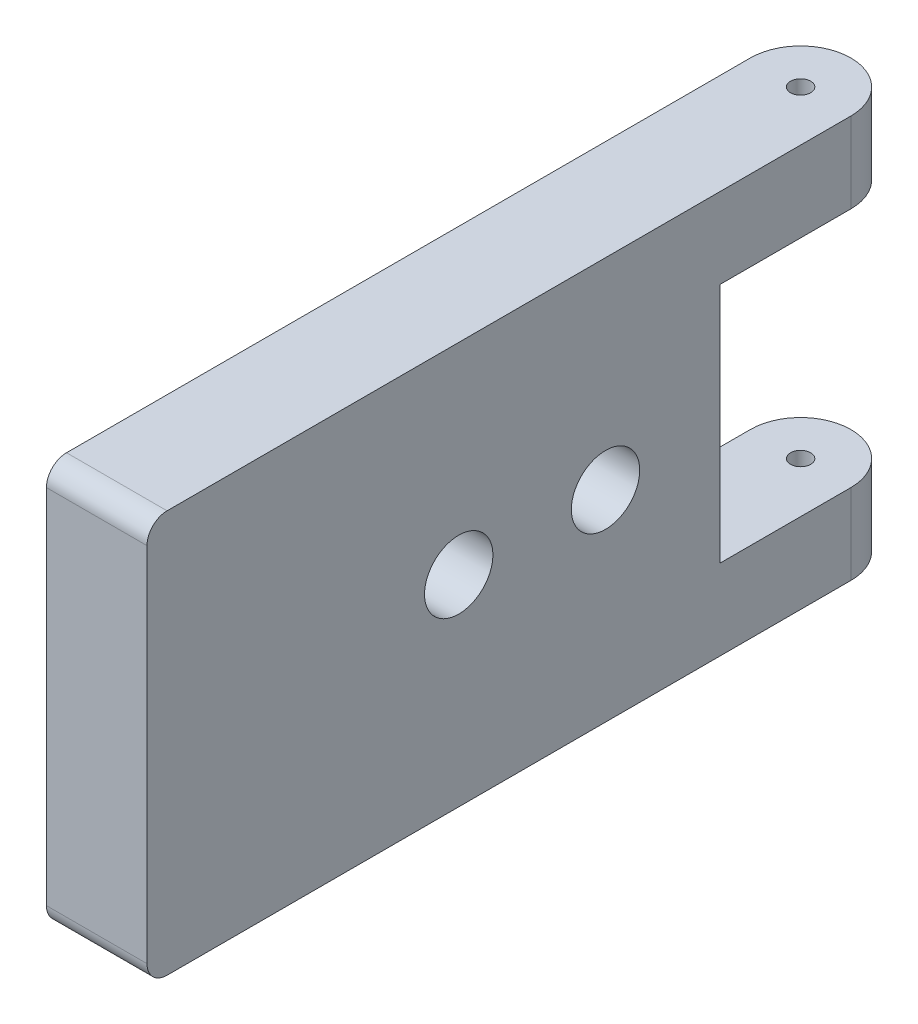
ISO-10303-21;
HEADER;
FILE_DESCRIPTION(('STEP AP214'),'2;1');
FILE_NAME('part.step','',(''),(''),'','','');
FILE_SCHEMA(('AUTOMOTIVE_DESIGN { 1 0 10303 214 1 1 1 1 }'));
ENDSEC;
DATA;
#1=APPLICATION_CONTEXT('core data for automotive mechanical design processes');
#2=APPLICATION_PROTOCOL_DEFINITION('international standard','automotive_design',2000,#1);
#3=PRODUCT_CONTEXT('',#1,'mechanical');
#4=PRODUCT('Part','Part','',(#3));
#5=PRODUCT_RELATED_PRODUCT_CATEGORY('part','',(#4));
#6=PRODUCT_DEFINITION_FORMATION('','',#4);
#7=PRODUCT_DEFINITION_CONTEXT('part definition',#1,'design');
#8=PRODUCT_DEFINITION('design','',#6,#7);
#9=PRODUCT_DEFINITION_SHAPE('','',#8);
#10=(LENGTH_UNIT() NAMED_UNIT(*) SI_UNIT(.MILLI.,.METRE.));
#11=(NAMED_UNIT(*) PLANE_ANGLE_UNIT() SI_UNIT($,.RADIAN.));
#12=(NAMED_UNIT(*) SI_UNIT($,.STERADIAN.) SOLID_ANGLE_UNIT());
#13=UNCERTAINTY_MEASURE_WITH_UNIT(LENGTH_MEASURE(1.E-05),#10,'distance_accuracy_value','');
#14=(GEOMETRIC_REPRESENTATION_CONTEXT(3) GLOBAL_UNCERTAINTY_ASSIGNED_CONTEXT((#13)) GLOBAL_UNIT_ASSIGNED_CONTEXT((#10,
#11,#12)) REPRESENTATION_CONTEXT('',''));
#15=CARTESIAN_POINT('',(0.,0.,0.));
#16=DIRECTION('',(0.,0.,1.));
#17=DIRECTION('',(1.,0.,0.));
#18=AXIS2_PLACEMENT_3D('',#15,#16,#17);
#19=CARTESIAN_POINT('',(0.,20.,0.));
#20=DIRECTION('',(0.,-1.,0.));
#21=DIRECTION('',(0.,0.,-1.));
#22=AXIS2_PLACEMENT_3D('',#19,#20,#21);
#23=CYLINDRICAL_SURFACE('',#22,2.5);
#24=CARTESIAN_POINT('',(0.,4.,0.));
#25=DIRECTION('',(0.,-1.,0.));
#26=DIRECTION('',(0.,0.,-1.));
#27=AXIS2_PLACEMENT_3D('',#24,#25,#26);
#28=CIRCLE('',#27,2.5);
#29=CARTESIAN_POINT('',(-2.5,4.,0.));
#30=VERTEX_POINT('',#29);
#31=CARTESIAN_POINT('',(2.5,4.,0.));
#32=VERTEX_POINT('',#31);
#33=EDGE_CURVE('E154',#30,#32,#28,.T.);
#34=ORIENTED_EDGE('',*,*,#33,.T.);
#35=DIRECTION('',(0.,-1.,0.));
#36=VECTOR('',#35,1.);
#37=CARTESIAN_POINT('',(2.5,20.,0.));
#38=LINE('',#37,#36);
#39=CARTESIAN_POINT('',(2.5,0.,0.));
#40=VERTEX_POINT('',#39);
#41=EDGE_CURVE('E180',#32,#40,#38,.T.);
#42=ORIENTED_EDGE('',*,*,#41,.T.);
#43=CARTESIAN_POINT('',(0.,0.,0.));
#44=DIRECTION('',(0.,1.,0.));
#45=DIRECTION('',(0.,0.,1.));
#46=AXIS2_PLACEMENT_3D('',#43,#44,#45);
#47=CIRCLE('',#46,2.5);
#48=CARTESIAN_POINT('',(-2.5,0.,0.));
#49=VERTEX_POINT('',#48);
#50=EDGE_CURVE('E167',#40,#49,#47,.T.);
#51=ORIENTED_EDGE('',*,*,#50,.T.);
#52=DIRECTION('',(0.,-1.,0.));
#53=VECTOR('',#52,1.);
#54=CARTESIAN_POINT('',(-2.5,20.,0.));
#55=LINE('',#54,#53);
#56=EDGE_CURVE('E171',#30,#49,#55,.T.);
#57=ORIENTED_EDGE('',*,*,#56,.F.);
#58=EDGE_LOOP('',(#34,#42,#51,#57));
#59=FACE_BOUND('',#58,.T.);
#60=ADVANCED_FACE('F35',(#59),#23,.T.);
#61=CARTESIAN_POINT('',(0.,20.,0.));
#62=DIRECTION('',(0.,-1.,0.));
#63=DIRECTION('',(0.,0.,-1.));
#64=AXIS2_PLACEMENT_3D('',#61,#62,#63);
#65=CYLINDRICAL_SURFACE('',#64,0.5);
#66=CARTESIAN_POINT('',(0.,4.,0.));
#67=DIRECTION('',(0.,-1.,0.));
#68=DIRECTION('',(0.,0.,-1.));
#69=AXIS2_PLACEMENT_3D('',#66,#67,#68);
#70=CIRCLE('',#69,0.5);
#71=CARTESIAN_POINT('',(0.,4.,-0.5));
#72=VERTEX_POINT('',#71);
#73=EDGE_CURVE('E153',#72,#72,#70,.T.);
#74=ORIENTED_EDGE('',*,*,#73,.F.);
#75=EDGE_LOOP('',(#74));
#76=FACE_BOUND('',#75,.T.);
#77=CARTESIAN_POINT('',(0.,0.,0.));
#78=DIRECTION('',(0.,1.,0.));
#79=DIRECTION('',(0.,0.,1.));
#80=AXIS2_PLACEMENT_3D('',#77,#78,#79);
#81=CIRCLE('',#80,0.5);
#82=CARTESIAN_POINT('',(0.,0.,0.5));
#83=VERTEX_POINT('',#82);
#84=EDGE_CURVE('E156',#83,#83,#81,.T.);
#85=ORIENTED_EDGE('',*,*,#84,.F.);
#86=EDGE_LOOP('',(#85));
#87=FACE_BOUND('',#86,.T.);
#88=ADVANCED_FACE('F241',(#76,#87),#65,.F.);
#89=CARTESIAN_POINT('',(0.,20.,0.));
#90=DIRECTION('',(0.,1.,0.));
#91=DIRECTION('',(0.,0.,1.));
#92=AXIS2_PLACEMENT_3D('',#89,#90,#91);
#93=PLANE('',#92);
#94=DIRECTION('',(0.,0.,1.));
#95=VECTOR('',#94,1.);
#96=CARTESIAN_POINT('',(-2.5,20.,35.));
#97=LINE('',#96,#95);
#98=CARTESIAN_POINT('',(-2.5,20.,0.));
#99=VERTEX_POINT('',#98);
#100=CARTESIAN_POINT('',(-2.5,20.,34.));
#101=VERTEX_POINT('',#100);
#102=EDGE_CURVE('E163',#99,#101,#97,.T.);
#103=ORIENTED_EDGE('',*,*,#102,.T.);
#104=DIRECTION('',(1.,0.,0.));
#105=VECTOR('',#104,1.);
#106=CARTESIAN_POINT('',(2.5,20.,34.));
#107=LINE('',#106,#105);
#108=CARTESIAN_POINT('',(2.5,20.,34.));
#109=VERTEX_POINT('',#108);
#110=EDGE_CURVE('E188',#101,#109,#107,.T.);
#111=ORIENTED_EDGE('',*,*,#110,.T.);
#112=DIRECTION('',(0.,0.,-1.));
#113=VECTOR('',#112,1.);
#114=CARTESIAN_POINT('',(2.5,20.,35.));
#115=LINE('',#114,#113);
#116=CARTESIAN_POINT('',(2.5,20.,0.));
#117=VERTEX_POINT('',#116);
#118=EDGE_CURVE('E166',#109,#117,#115,.T.);
#119=ORIENTED_EDGE('',*,*,#118,.T.);
#120=CARTESIAN_POINT('',(0.,20.,0.));
#121=DIRECTION('',(0.,1.,0.));
#122=DIRECTION('',(0.,0.,1.));
#123=AXIS2_PLACEMENT_3D('',#120,#121,#122);
#124=CIRCLE('',#123,2.5);
#125=EDGE_CURVE('E169',#117,#99,#124,.T.);
#126=ORIENTED_EDGE('',*,*,#125,.T.);
#127=EDGE_LOOP('',(#103,#111,#119,#126));
#128=FACE_BOUND('',#127,.T.);
#129=CARTESIAN_POINT('',(0.,20.,0.));
#130=DIRECTION('',(0.,1.,0.));
#131=DIRECTION('',(0.,0.,1.));
#132=AXIS2_PLACEMENT_3D('',#129,#130,#131);
#133=CIRCLE('',#132,0.5);
#134=CARTESIAN_POINT('',(0.,20.,0.5));
#135=VERTEX_POINT('',#134);
#136=EDGE_CURVE('E157',#135,#135,#133,.T.);
#137=ORIENTED_EDGE('',*,*,#136,.F.);
#138=EDGE_LOOP('',(#137));
#139=FACE_BOUND('',#138,.T.);
#140=ADVANCED_FACE('F211',(#128,#139),#93,.T.);
#141=CARTESIAN_POINT('',(0.,0.,0.));
#142=DIRECTION('',(0.,1.,0.));
#143=DIRECTION('',(0.,0.,1.));
#144=AXIS2_PLACEMENT_3D('',#141,#142,#143);
#145=PLANE('',#144);
#146=DIRECTION('',(0.,0.,-1.));
#147=VECTOR('',#146,1.);
#148=CARTESIAN_POINT('',(2.5,0.,35.));
#149=LINE('',#148,#147);
#150=CARTESIAN_POINT('',(2.5,0.,34.));
#151=VERTEX_POINT('',#150);
#152=EDGE_CURVE('E173',#151,#40,#149,.T.);
#153=ORIENTED_EDGE('',*,*,#152,.F.);
#154=DIRECTION('',(1.,0.,0.));
#155=VECTOR('',#154,1.);
#156=CARTESIAN_POINT('',(0.,0.,34.));
#157=LINE('',#156,#155);
#158=CARTESIAN_POINT('',(-2.5,0.,34.));
#159=VERTEX_POINT('',#158);
#160=EDGE_CURVE('E11',#151,#159,#157,.F.);
#161=ORIENTED_EDGE('',*,*,#160,.T.);
#162=DIRECTION('',(0.,0.,1.));
#163=VECTOR('',#162,1.);
#164=CARTESIAN_POINT('',(-2.5,0.,35.));
#165=LINE('',#164,#163);
#166=EDGE_CURVE('E160',#49,#159,#165,.T.);
#167=ORIENTED_EDGE('',*,*,#166,.F.);
#168=ORIENTED_EDGE('',*,*,#50,.F.);
#169=EDGE_LOOP('',(#153,#161,#167,#168));
#170=FACE_BOUND('',#169,.T.);
#171=ORIENTED_EDGE('',*,*,#84,.T.);
#172=EDGE_LOOP('',(#171));
#173=FACE_BOUND('',#172,.T.);
#174=ADVANCED_FACE('F223',(#170,#173),#145,.F.);
#175=CARTESIAN_POINT('',(-2.5,20.,35.));
#176=DIRECTION('',(1.,0.,0.));
#177=DIRECTION('',(0.,0.,-1.));
#178=AXIS2_PLACEMENT_3D('',#175,#176,#177);
#179=PLANE('',#178);
#180=CARTESIAN_POINT('',(-2.5,10.,12.2));
#181=DIRECTION('',(-1.,0.,0.));
#182=DIRECTION('',(0.,0.,1.));
#183=AXIS2_PLACEMENT_3D('',#180,#181,#182);
#184=CIRCLE('',#183,3.15);
#185=CARTESIAN_POINT('',(-2.5,10.,15.35));
#186=VERTEX_POINT('',#185);
#187=EDGE_CURVE('E305',#186,#186,#184,.T.);
#188=ORIENTED_EDGE('',*,*,#187,.F.);
#189=EDGE_LOOP('',(#188));
#190=FACE_BOUND('',#189,.T.);
#191=CARTESIAN_POINT('',(-2.5,10.,19.5));
#192=DIRECTION('',(-1.,0.,0.));
#193=DIRECTION('',(0.,0.,1.));
#194=AXIS2_PLACEMENT_3D('',#191,#192,#193);
#195=CIRCLE('',#194,3.15);
#196=CARTESIAN_POINT('',(-2.5,10.,22.65));
#197=VERTEX_POINT('',#196);
#198=EDGE_CURVE('E312',#197,#197,#195,.T.);
#199=ORIENTED_EDGE('',*,*,#198,.F.);
#200=EDGE_LOOP('',(#199));
#201=FACE_BOUND('',#200,.T.);
#202=DIRECTION('',(0.,-1.,0.));
#203=VECTOR('',#202,1.);
#204=CARTESIAN_POINT('',(-2.5,20.,35.));
#205=LINE('',#204,#203);
#206=CARTESIAN_POINT('',(-2.5,19.,35.));
#207=VERTEX_POINT('',#206);
#208=CARTESIAN_POINT('',(-2.5,1.,35.));
#209=VERTEX_POINT('',#208);
#210=EDGE_CURVE('E186',#207,#209,#205,.T.);
#211=ORIENTED_EDGE('',*,*,#210,.F.);
#212=CARTESIAN_POINT('',(-2.5,19.,34.));
#213=DIRECTION('',(1.,0.,0.));
#214=DIRECTION('',(0.,0.,-1.));
#215=AXIS2_PLACEMENT_3D('',#212,#213,#214);
#216=CIRCLE('',#215,1.);
#217=EDGE_CURVE('E43',#207,#101,#216,.F.);
#218=ORIENTED_EDGE('',*,*,#217,.T.);
#219=ORIENTED_EDGE('',*,*,#102,.F.);
#220=CARTESIAN_POINT('',(-2.5,16.,0.));
#221=VERTEX_POINT('',#220);
#222=EDGE_CURVE('E177',#99,#221,#55,.T.);
#223=ORIENTED_EDGE('',*,*,#222,.T.);
#224=DIRECTION('',(0.,0.,1.));
#225=VECTOR('',#224,1.);
#226=CARTESIAN_POINT('',(-2.5,16.,-2.5));
#227=LINE('',#226,#225);
#228=CARTESIAN_POINT('',(-2.5,16.,6.5));
#229=VERTEX_POINT('',#228);
#230=EDGE_CURVE('E142',#221,#229,#227,.T.);
#231=ORIENTED_EDGE('',*,*,#230,.T.);
#232=DIRECTION('',(0.,-1.,0.));
#233=VECTOR('',#232,1.);
#234=CARTESIAN_POINT('',(-2.5,16.,6.5));
#235=LINE('',#234,#233);
#236=CARTESIAN_POINT('',(-2.5,4.,6.5));
#237=VERTEX_POINT('',#236);
#238=EDGE_CURVE('E131',#229,#237,#235,.T.);
#239=ORIENTED_EDGE('',*,*,#238,.T.);
#240=DIRECTION('',(0.,0.,-1.));
#241=VECTOR('',#240,1.);
#242=CARTESIAN_POINT('',(-2.5,4.,6.5));
#243=LINE('',#242,#241);
#244=EDGE_CURVE('E134',#237,#30,#243,.T.);
#245=ORIENTED_EDGE('',*,*,#244,.T.);
#246=ORIENTED_EDGE('',*,*,#56,.T.);
#247=ORIENTED_EDGE('',*,*,#166,.T.);
#248=CARTESIAN_POINT('',(-2.5,1.,34.));
#249=DIRECTION('',(1.,0.,0.));
#250=DIRECTION('',(0.,0.,-1.));
#251=AXIS2_PLACEMENT_3D('',#248,#249,#250);
#252=CIRCLE('',#251,1.);
#253=EDGE_CURVE('E55',#159,#209,#252,.F.);
#254=ORIENTED_EDGE('',*,*,#253,.T.);
#255=EDGE_LOOP('',(#211,#218,#219,#223,#231,#239,#245,#246,#247,#254));
#256=FACE_BOUND('',#255,.T.);
#257=ADVANCED_FACE('F206',(#190,#201,#256),#179,.F.);
#258=CARTESIAN_POINT('',(-2.5,20.,35.));
#259=DIRECTION('',(0.,0.,-1.));
#260=DIRECTION('',(-1.,0.,0.));
#261=AXIS2_PLACEMENT_3D('',#258,#259,#260);
#262=PLANE('',#261);
#263=DIRECTION('',(0.,-1.,0.));
#264=VECTOR('',#263,1.);
#265=CARTESIAN_POINT('',(2.5,20.,35.));
#266=LINE('',#265,#264);
#267=CARTESIAN_POINT('',(2.5,19.,35.));
#268=VERTEX_POINT('',#267);
#269=CARTESIAN_POINT('',(2.5,1.,35.));
#270=VERTEX_POINT('',#269);
#271=EDGE_CURVE('E183',#268,#270,#266,.T.);
#272=ORIENTED_EDGE('',*,*,#271,.F.);
#273=DIRECTION('',(1.,0.,0.));
#274=VECTOR('',#273,1.);
#275=CARTESIAN_POINT('',(-2.5,19.,35.));
#276=LINE('',#275,#274);
#277=EDGE_CURVE('E202',#268,#207,#276,.F.);
#278=ORIENTED_EDGE('',*,*,#277,.T.);
#279=ORIENTED_EDGE('',*,*,#210,.T.);
#280=DIRECTION('',(1.,0.,0.));
#281=VECTOR('',#280,1.);
#282=CARTESIAN_POINT('',(-2.5,1.,35.));
#283=LINE('',#282,#281);
#284=EDGE_CURVE('E199',#209,#270,#283,.T.);
#285=ORIENTED_EDGE('',*,*,#284,.T.);
#286=EDGE_LOOP('',(#272,#278,#279,#285));
#287=FACE_BOUND('',#286,.T.);
#288=ADVANCED_FACE('F218',(#287),#262,.F.);
#289=CARTESIAN_POINT('',(2.5,20.,35.));
#290=DIRECTION('',(-1.,0.,0.));
#291=DIRECTION('',(0.,0.,1.));
#292=AXIS2_PLACEMENT_3D('',#289,#290,#291);
#293=PLANE('',#292);
#294=CARTESIAN_POINT('',(2.5,10.,12.2));
#295=DIRECTION('',(-1.,0.,0.));
#296=DIRECTION('',(0.,0.,1.));
#297=AXIS2_PLACEMENT_3D('',#294,#295,#296);
#298=CIRCLE('',#297,1.7);
#299=CARTESIAN_POINT('',(2.5,10.,13.9));
#300=VERTEX_POINT('',#299);
#301=EDGE_CURVE('E307',#300,#300,#298,.T.);
#302=ORIENTED_EDGE('',*,*,#301,.T.);
#303=EDGE_LOOP('',(#302));
#304=FACE_BOUND('',#303,.T.);
#305=CARTESIAN_POINT('',(2.5,10.,19.5));
#306=DIRECTION('',(-1.,0.,0.));
#307=DIRECTION('',(0.,0.,1.));
#308=AXIS2_PLACEMENT_3D('',#305,#306,#307);
#309=CIRCLE('',#308,1.7);
#310=CARTESIAN_POINT('',(2.5,10.,21.2));
#311=VERTEX_POINT('',#310);
#312=EDGE_CURVE('E124',#311,#311,#309,.T.);
#313=ORIENTED_EDGE('',*,*,#312,.T.);
#314=EDGE_LOOP('',(#313));
#315=FACE_BOUND('',#314,.T.);
#316=ORIENTED_EDGE('',*,*,#118,.F.);
#317=CARTESIAN_POINT('',(2.5,19.,34.));
#318=DIRECTION('',(-1.,0.,0.));
#319=DIRECTION('',(0.,0.,1.));
#320=AXIS2_PLACEMENT_3D('',#317,#318,#319);
#321=CIRCLE('',#320,1.);
#322=EDGE_CURVE('E197',#109,#268,#321,.F.);
#323=ORIENTED_EDGE('',*,*,#322,.T.);
#324=ORIENTED_EDGE('',*,*,#271,.T.);
#325=CARTESIAN_POINT('',(2.5,1.,34.));
#326=DIRECTION('',(-1.,0.,0.));
#327=DIRECTION('',(0.,0.,1.));
#328=AXIS2_PLACEMENT_3D('',#325,#326,#327);
#329=CIRCLE('',#328,1.);
#330=EDGE_CURVE('E195',#270,#151,#329,.F.);
#331=ORIENTED_EDGE('',*,*,#330,.T.);
#332=ORIENTED_EDGE('',*,*,#152,.T.);
#333=ORIENTED_EDGE('',*,*,#41,.F.);
#334=DIRECTION('',(0.,0.,-1.));
#335=VECTOR('',#334,1.);
#336=CARTESIAN_POINT('',(2.5,4.,6.5));
#337=LINE('',#336,#335);
#338=CARTESIAN_POINT('',(2.5,4.,6.5));
#339=VERTEX_POINT('',#338);
#340=EDGE_CURVE('E140',#339,#32,#337,.T.);
#341=ORIENTED_EDGE('',*,*,#340,.F.);
#342=DIRECTION('',(0.,-1.,0.));
#343=VECTOR('',#342,1.);
#344=CARTESIAN_POINT('',(2.5,16.,6.5));
#345=LINE('',#344,#343);
#346=CARTESIAN_POINT('',(2.5,16.,6.5));
#347=VERTEX_POINT('',#346);
#348=EDGE_CURVE('E123',#347,#339,#345,.T.);
#349=ORIENTED_EDGE('',*,*,#348,.F.);
#350=DIRECTION('',(0.,0.,1.));
#351=VECTOR('',#350,1.);
#352=CARTESIAN_POINT('',(2.5,16.,-2.5));
#353=LINE('',#352,#351);
#354=CARTESIAN_POINT('',(2.5,16.,0.));
#355=VERTEX_POINT('',#354);
#356=EDGE_CURVE('E112',#355,#347,#353,.T.);
#357=ORIENTED_EDGE('',*,*,#356,.F.);
#358=EDGE_CURVE('E181',#117,#355,#38,.T.);
#359=ORIENTED_EDGE('',*,*,#358,.F.);
#360=EDGE_LOOP('',(#316,#323,#324,#331,#332,#333,#341,#349,#357,#359));
#361=FACE_BOUND('',#360,.T.);
#362=ADVANCED_FACE('F137',(#304,#315,#361),#293,.F.);
#363=ORIENTED_EDGE('',*,*,#358,.T.);
#364=CARTESIAN_POINT('',(0.,16.,0.));
#365=DIRECTION('',(0.,1.,0.));
#366=DIRECTION('',(0.,0.,1.));
#367=AXIS2_PLACEMENT_3D('',#364,#365,#366);
#368=CIRCLE('',#367,2.5);
#369=EDGE_CURVE('E118',#355,#221,#368,.T.);
#370=ORIENTED_EDGE('',*,*,#369,.T.);
#371=ORIENTED_EDGE('',*,*,#222,.F.);
#372=ORIENTED_EDGE('',*,*,#125,.F.);
#373=EDGE_LOOP('',(#363,#370,#371,#372));
#374=FACE_BOUND('',#373,.T.);
#375=ADVANCED_FACE('F231',(#374),#23,.T.);
#376=CARTESIAN_POINT('',(0.,16.,0.));
#377=DIRECTION('',(0.,1.,0.));
#378=DIRECTION('',(0.,0.,1.));
#379=AXIS2_PLACEMENT_3D('',#376,#377,#378);
#380=CIRCLE('',#379,0.5);
#381=CARTESIAN_POINT('',(0.,16.,0.5));
#382=VERTEX_POINT('',#381);
#383=EDGE_CURVE('E150',#382,#382,#380,.T.);
#384=ORIENTED_EDGE('',*,*,#383,.F.);
#385=EDGE_LOOP('',(#384));
#386=FACE_BOUND('',#385,.T.);
#387=ORIENTED_EDGE('',*,*,#136,.T.);
#388=EDGE_LOOP('',(#387));
#389=FACE_BOUND('',#388,.T.);
#390=ADVANCED_FACE('F233',(#386,#389),#65,.F.);
#391=CARTESIAN_POINT('',(-2.5,4.,6.5));
#392=DIRECTION('',(0.,-1.,0.));
#393=DIRECTION('',(0.,0.,-1.));
#394=AXIS2_PLACEMENT_3D('',#391,#392,#393);
#395=PLANE('',#394);
#396=ORIENTED_EDGE('',*,*,#73,.T.);
#397=EDGE_LOOP('',(#396));
#398=FACE_BOUND('',#397,.T.);
#399=ORIENTED_EDGE('',*,*,#33,.F.);
#400=ORIENTED_EDGE('',*,*,#244,.F.);
#401=DIRECTION('',(1.,0.,0.));
#402=VECTOR('',#401,1.);
#403=CARTESIAN_POINT('',(-2.5,4.,6.5));
#404=LINE('',#403,#402);
#405=EDGE_CURVE('E133',#237,#339,#404,.T.);
#406=ORIENTED_EDGE('',*,*,#405,.T.);
#407=ORIENTED_EDGE('',*,*,#340,.T.);
#408=EDGE_LOOP('',(#399,#400,#406,#407));
#409=FACE_BOUND('',#408,.T.);
#410=ADVANCED_FACE('F229',(#398,#409),#395,.F.);
#411=CARTESIAN_POINT('',(-2.5,16.,-2.5));
#412=DIRECTION('',(0.,1.,0.));
#413=DIRECTION('',(0.,0.,1.));
#414=AXIS2_PLACEMENT_3D('',#411,#412,#413);
#415=PLANE('',#414);
#416=ORIENTED_EDGE('',*,*,#383,.T.);
#417=EDGE_LOOP('',(#416));
#418=FACE_BOUND('',#417,.T.);
#419=ORIENTED_EDGE('',*,*,#356,.T.);
#420=DIRECTION('',(1.,0.,0.));
#421=VECTOR('',#420,1.);
#422=CARTESIAN_POINT('',(-2.5,16.,6.5));
#423=LINE('',#422,#421);
#424=EDGE_CURVE('E116',#229,#347,#423,.T.);
#425=ORIENTED_EDGE('',*,*,#424,.F.);
#426=ORIENTED_EDGE('',*,*,#230,.F.);
#427=ORIENTED_EDGE('',*,*,#369,.F.);
#428=EDGE_LOOP('',(#419,#425,#426,#427));
#429=FACE_BOUND('',#428,.T.);
#430=ADVANCED_FACE('F114',(#418,#429),#415,.F.);
#431=CARTESIAN_POINT('',(-2.5,16.,6.5));
#432=DIRECTION('',(0.,0.,1.));
#433=DIRECTION('',(0.,-1.,0.));
#434=AXIS2_PLACEMENT_3D('',#431,#432,#433);
#435=PLANE('',#434);
#436=ORIENTED_EDGE('',*,*,#405,.F.);
#437=ORIENTED_EDGE('',*,*,#238,.F.);
#438=ORIENTED_EDGE('',*,*,#424,.T.);
#439=ORIENTED_EDGE('',*,*,#348,.T.);
#440=EDGE_LOOP('',(#436,#437,#438,#439));
#441=FACE_BOUND('',#440,.T.);
#442=ADVANCED_FACE('F128',(#441),#435,.F.);
#443=CARTESIAN_POINT('',(0.,19.,34.));
#444=DIRECTION('',(-1.,0.,0.));
#445=DIRECTION('',(0.,0.,1.));
#446=AXIS2_PLACEMENT_3D('',#443,#444,#445);
#447=CYLINDRICAL_SURFACE('',#446,1.);
#448=ORIENTED_EDGE('',*,*,#217,.F.);
#449=ORIENTED_EDGE('',*,*,#277,.F.);
#450=ORIENTED_EDGE('',*,*,#322,.F.);
#451=ORIENTED_EDGE('',*,*,#110,.F.);
#452=EDGE_LOOP('',(#448,#449,#450,#451));
#453=FACE_BOUND('',#452,.T.);
#454=ADVANCED_FACE('F215',(#453),#447,.T.);
#455=CARTESIAN_POINT('',(-2.5,1.,34.));
#456=DIRECTION('',(1.,0.,0.));
#457=DIRECTION('',(0.,0.,-1.));
#458=AXIS2_PLACEMENT_3D('',#455,#456,#457);
#459=CYLINDRICAL_SURFACE('',#458,1.);
#460=ORIENTED_EDGE('',*,*,#253,.F.);
#461=ORIENTED_EDGE('',*,*,#160,.F.);
#462=ORIENTED_EDGE('',*,*,#330,.F.);
#463=ORIENTED_EDGE('',*,*,#284,.F.);
#464=EDGE_LOOP('',(#460,#461,#462,#463));
#465=FACE_BOUND('',#464,.T.);
#466=ADVANCED_FACE('F37',(#465),#459,.T.);
#467=CARTESIAN_POINT('',(-2.5,10.,19.5));
#468=DIRECTION('',(-1.,0.,0.));
#469=DIRECTION('',(0.,0.,1.));
#470=AXIS2_PLACEMENT_3D('',#467,#468,#469);
#471=CYLINDRICAL_SURFACE('',#470,1.7);
#472=ORIENTED_EDGE('',*,*,#312,.F.);
#473=EDGE_LOOP('',(#472));
#474=FACE_BOUND('',#473,.T.);
#475=CARTESIAN_POINT('',(-1.05,10.,19.5));
#476=DIRECTION('',(-1.,0.,0.));
#477=DIRECTION('',(0.,0.,1.));
#478=AXIS2_PLACEMENT_3D('',#475,#476,#477);
#479=CIRCLE('',#478,1.7);
#480=CARTESIAN_POINT('',(-1.05,10.,21.2));
#481=VERTEX_POINT('',#480);
#482=EDGE_CURVE('E315',#481,#481,#479,.T.);
#483=ORIENTED_EDGE('',*,*,#482,.T.);
#484=EDGE_LOOP('',(#483));
#485=FACE_BOUND('',#484,.T.);
#486=ADVANCED_FACE('F275',(#474,#485),#471,.F.);
#487=CARTESIAN_POINT('',(-2.5,10.,19.5));
#488=DIRECTION('',(-1.,0.,0.));
#489=DIRECTION('',(0.,0.,1.));
#490=AXIS2_PLACEMENT_3D('',#487,#488,#489);
#491=CONICAL_SURFACE('',#490,3.15,0.785398163397449);
#492=ORIENTED_EDGE('',*,*,#482,.F.);
#493=EDGE_LOOP('',(#492));
#494=FACE_BOUND('',#493,.T.);
#495=ORIENTED_EDGE('',*,*,#198,.T.);
#496=EDGE_LOOP('',(#495));
#497=FACE_BOUND('',#496,.T.);
#498=ADVANCED_FACE('F286',(#494,#497),#491,.F.);
#499=CARTESIAN_POINT('',(-2.5,10.,12.2));
#500=DIRECTION('',(-1.,0.,0.));
#501=DIRECTION('',(0.,0.,1.));
#502=AXIS2_PLACEMENT_3D('',#499,#500,#501);
#503=CYLINDRICAL_SURFACE('',#502,1.7);
#504=ORIENTED_EDGE('',*,*,#301,.F.);
#505=EDGE_LOOP('',(#504));
#506=FACE_BOUND('',#505,.T.);
#507=CARTESIAN_POINT('',(-1.05,10.,12.2));
#508=DIRECTION('',(-1.,0.,0.));
#509=DIRECTION('',(0.,0.,1.));
#510=AXIS2_PLACEMENT_3D('',#507,#508,#509);
#511=CIRCLE('',#510,1.7);
#512=CARTESIAN_POINT('',(-1.05,10.,13.9));
#513=VERTEX_POINT('',#512);
#514=EDGE_CURVE('E303',#513,#513,#511,.T.);
#515=ORIENTED_EDGE('',*,*,#514,.T.);
#516=EDGE_LOOP('',(#515));
#517=FACE_BOUND('',#516,.T.);
#518=ADVANCED_FACE('F290',(#506,#517),#503,.F.);
#519=CARTESIAN_POINT('',(-2.5,10.,12.2));
#520=DIRECTION('',(-1.,0.,0.));
#521=DIRECTION('',(0.,0.,1.));
#522=AXIS2_PLACEMENT_3D('',#519,#520,#521);
#523=CONICAL_SURFACE('',#522,3.15,0.785398163397449);
#524=ORIENTED_EDGE('',*,*,#514,.F.);
#525=EDGE_LOOP('',(#524));
#526=FACE_BOUND('',#525,.T.);
#527=ORIENTED_EDGE('',*,*,#187,.T.);
#528=EDGE_LOOP('',(#527));
#529=FACE_BOUND('',#528,.T.);
#530=ADVANCED_FACE('F294',(#526,#529),#523,.F.);
#531=CLOSED_SHELL('',(#60,#88,#140,#174,#257,#288,#362,#375,#390,#410,#430,#442,#454,#466,#486,
#498,#518,#530));
#532=MANIFOLD_SOLID_BREP('B2',#531);
#533=ADVANCED_BREP_SHAPE_REPRESENTATION('',(#18,#532),#14);
#534=SHAPE_DEFINITION_REPRESENTATION(#9,#533);
ENDSEC;
END-ISO-10303-21;
